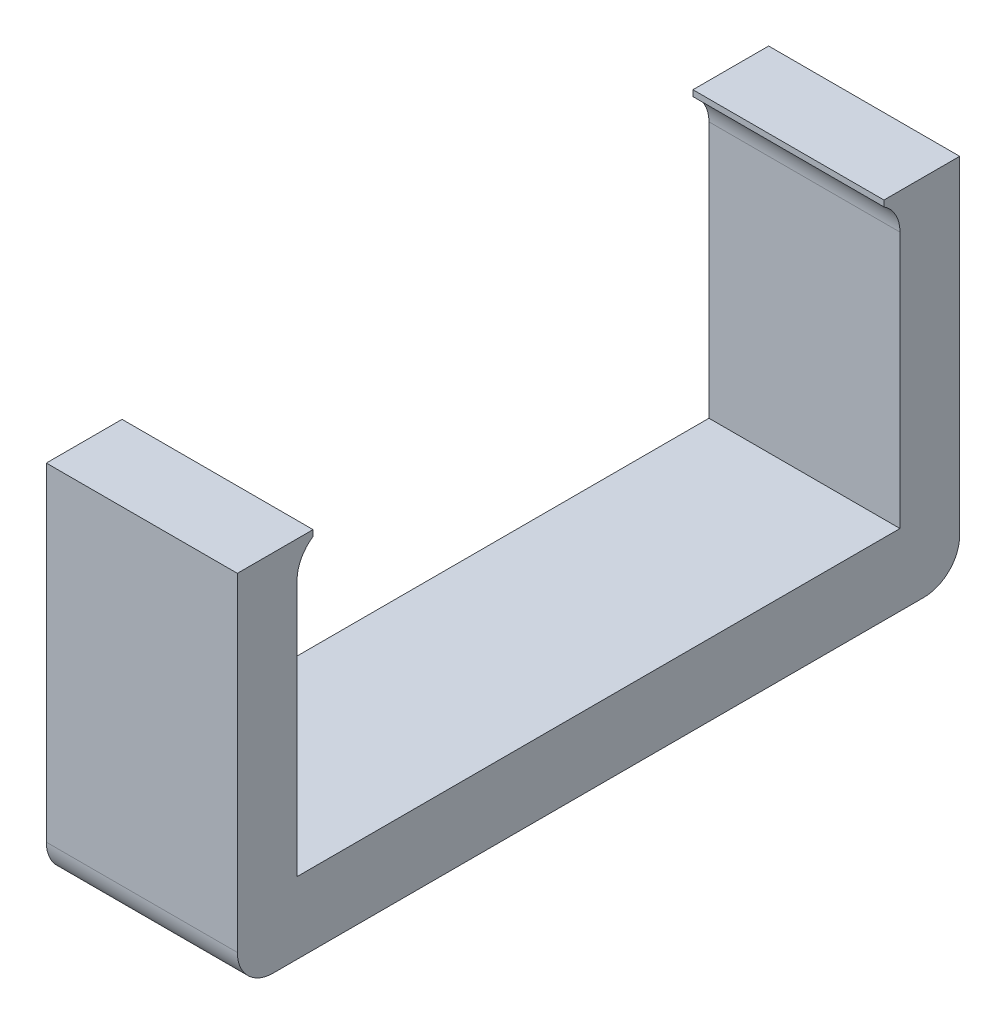
ISO-10303-21;
HEADER;
FILE_DESCRIPTION(('STEP AP214'),'2;1');
FILE_NAME('part.step','',(''),(''),'','','');
FILE_SCHEMA(('AUTOMOTIVE_DESIGN { 1 0 10303 214 1 1 1 1 }'));
ENDSEC;
DATA;
#1=APPLICATION_CONTEXT('core data for automotive mechanical design processes');
#2=APPLICATION_PROTOCOL_DEFINITION('international standard','automotive_design',2000,#1);
#3=PRODUCT_CONTEXT('',#1,'mechanical');
#4=PRODUCT('Part','Part','',(#3));
#5=PRODUCT_RELATED_PRODUCT_CATEGORY('part','',(#4));
#6=PRODUCT_DEFINITION_FORMATION('','',#4);
#7=PRODUCT_DEFINITION_CONTEXT('part definition',#1,'design');
#8=PRODUCT_DEFINITION('design','',#6,#7);
#9=PRODUCT_DEFINITION_SHAPE('','',#8);
#10=(LENGTH_UNIT() NAMED_UNIT(*) SI_UNIT(.MILLI.,.METRE.));
#11=(NAMED_UNIT(*) PLANE_ANGLE_UNIT() SI_UNIT($,.RADIAN.));
#12=(NAMED_UNIT(*) SI_UNIT($,.STERADIAN.) SOLID_ANGLE_UNIT());
#13=UNCERTAINTY_MEASURE_WITH_UNIT(LENGTH_MEASURE(1.E-05),#10,'distance_accuracy_value','');
#14=(GEOMETRIC_REPRESENTATION_CONTEXT(3) GLOBAL_UNCERTAINTY_ASSIGNED_CONTEXT((#13)) GLOBAL_UNIT_ASSIGNED_CONTEXT((#10,
#11,#12)) REPRESENTATION_CONTEXT('',''));
#15=CARTESIAN_POINT('',(0.,0.,0.));
#16=DIRECTION('',(0.,0.,1.));
#17=DIRECTION('',(1.,0.,0.));
#18=AXIS2_PLACEMENT_3D('',#15,#16,#17);
#19=CARTESIAN_POINT('',(8.,3.,-27.75));
#20=DIRECTION('',(0.,0.,-1.));
#21=DIRECTION('',(-1.,0.,0.));
#22=AXIS2_PLACEMENT_3D('',#19,#20,#21);
#23=PLANE('',#22);
#24=DIRECTION('',(0.,-1.,0.));
#25=VECTOR('',#24,1.);
#26=CARTESIAN_POINT('',(0.,3.,-27.75));
#27=LINE('',#26,#25);
#28=CARTESIAN_POINT('',(0.,13.75,-27.75));
#29=VERTEX_POINT('',#28);
#30=CARTESIAN_POINT('',(0.,3.,-27.75));
#31=VERTEX_POINT('',#30);
#32=EDGE_CURVE('E171',#29,#31,#27,.T.);
#33=ORIENTED_EDGE('',*,*,#32,.T.);
#34=DIRECTION('',(-1.,0.,0.));
#35=VECTOR('',#34,1.);
#36=CARTESIAN_POINT('',(8.,3.,-27.75));
#37=LINE('',#36,#35);
#38=CARTESIAN_POINT('',(8.,3.,-27.75));
#39=VERTEX_POINT('',#38);
#40=EDGE_CURVE('E11',#39,#31,#37,.T.);
#41=ORIENTED_EDGE('',*,*,#40,.F.);
#42=DIRECTION('',(0.,-1.,0.));
#43=VECTOR('',#42,1.);
#44=CARTESIAN_POINT('',(8.,3.,-27.75));
#45=LINE('',#44,#43);
#46=CARTESIAN_POINT('',(8.,13.75,-27.75));
#47=VERTEX_POINT('',#46);
#48=EDGE_CURVE('E197',#47,#39,#45,.T.);
#49=ORIENTED_EDGE('',*,*,#48,.F.);
#50=DIRECTION('',(-1.,0.,0.));
#51=VECTOR('',#50,1.);
#52=CARTESIAN_POINT('',(8.,13.75,-27.75));
#53=LINE('',#52,#51);
#54=EDGE_CURVE('E167',#47,#29,#53,.T.);
#55=ORIENTED_EDGE('',*,*,#54,.T.);
#56=EDGE_LOOP('',(#33,#41,#49,#55));
#57=FACE_BOUND('',#56,.T.);
#58=ADVANCED_FACE('F39',(#57),#23,.F.);
#59=CARTESIAN_POINT('',(8.,3.,-27.75));
#60=DIRECTION('',(0.,-1.,0.));
#61=DIRECTION('',(0.,0.,-1.));
#62=AXIS2_PLACEMENT_3D('',#59,#60,#61);
#63=PLANE('',#62);
#64=DIRECTION('',(0.,0.,1.));
#65=VECTOR('',#64,1.);
#66=CARTESIAN_POINT('',(0.,3.,-27.75));
#67=LINE('',#66,#65);
#68=CARTESIAN_POINT('',(0.,3.,-2.5));
#69=VERTEX_POINT('',#68);
#70=EDGE_CURVE('E174',#31,#69,#67,.T.);
#71=ORIENTED_EDGE('',*,*,#70,.T.);
#72=DIRECTION('',(-1.,0.,0.));
#73=VECTOR('',#72,1.);
#74=CARTESIAN_POINT('',(8.,3.,-2.5));
#75=LINE('',#74,#73);
#76=CARTESIAN_POINT('',(8.,3.,-2.5));
#77=VERTEX_POINT('',#76);
#78=EDGE_CURVE('E47',#77,#69,#75,.T.);
#79=ORIENTED_EDGE('',*,*,#78,.F.);
#80=DIRECTION('',(0.,0.,1.));
#81=VECTOR('',#80,1.);
#82=CARTESIAN_POINT('',(8.,3.,-27.75));
#83=LINE('',#82,#81);
#84=EDGE_CURVE('E116',#39,#77,#83,.T.);
#85=ORIENTED_EDGE('',*,*,#84,.F.);
#86=ORIENTED_EDGE('',*,*,#40,.T.);
#87=EDGE_LOOP('',(#71,#79,#85,#86));
#88=FACE_BOUND('',#87,.T.);
#89=ADVANCED_FACE('F285',(#88),#63,.F.);
#90=CARTESIAN_POINT('',(8.,3.,-2.5));
#91=DIRECTION('',(0.,0.,1.));
#92=DIRECTION('',(0.,-1.,0.));
#93=AXIS2_PLACEMENT_3D('',#90,#91,#92);
#94=PLANE('',#93);
#95=DIRECTION('',(0.,1.,0.));
#96=VECTOR('',#95,1.);
#97=CARTESIAN_POINT('',(0.,3.,-2.5));
#98=LINE('',#97,#96);
#99=CARTESIAN_POINT('',(0.,13.75,-2.5));
#100=VERTEX_POINT('',#99);
#101=EDGE_CURVE('E176',#69,#100,#98,.T.);
#102=ORIENTED_EDGE('',*,*,#101,.T.);
#103=DIRECTION('',(-1.,0.,0.));
#104=VECTOR('',#103,1.);
#105=CARTESIAN_POINT('',(8.,13.75,-2.5));
#106=LINE('',#105,#104);
#107=CARTESIAN_POINT('',(8.,13.75,-2.5));
#108=VERTEX_POINT('',#107);
#109=EDGE_CURVE('E222',#108,#100,#106,.T.);
#110=ORIENTED_EDGE('',*,*,#109,.F.);
#111=DIRECTION('',(0.,1.,0.));
#112=VECTOR('',#111,1.);
#113=CARTESIAN_POINT('',(8.,3.,-2.5));
#114=LINE('',#113,#112);
#115=EDGE_CURVE('E230',#77,#108,#114,.T.);
#116=ORIENTED_EDGE('',*,*,#115,.F.);
#117=ORIENTED_EDGE('',*,*,#78,.T.);
#118=EDGE_LOOP('',(#102,#110,#116,#117));
#119=FACE_BOUND('',#118,.T.);
#120=ADVANCED_FACE('F228',(#119),#94,.F.);
#121=CARTESIAN_POINT('',(8.,13.75,-4.));
#122=DIRECTION('',(-1.,0.,0.));
#123=DIRECTION('',(0.,0.,1.));
#124=AXIS2_PLACEMENT_3D('',#121,#122,#123);
#125=CYLINDRICAL_SURFACE('',#124,1.5);
#126=CARTESIAN_POINT('',(0.,13.75,-4.));
#127=DIRECTION('',(-1.,0.,0.));
#128=DIRECTION('',(0.,0.,1.));
#129=AXIS2_PLACEMENT_3D('',#126,#127,#128);
#130=CIRCLE('',#129,1.5);
#131=CARTESIAN_POINT('',(0.,15.,-3.17084380241115));
#132=VERTEX_POINT('',#131);
#133=EDGE_CURVE('E178',#100,#132,#130,.T.);
#134=ORIENTED_EDGE('',*,*,#133,.T.);
#135=DIRECTION('',(-1.,0.,0.));
#136=VECTOR('',#135,1.);
#137=CARTESIAN_POINT('',(8.,15.,-3.17084380241115));
#138=LINE('',#137,#136);
#139=CARTESIAN_POINT('',(8.,15.,-3.17084380241115));
#140=VERTEX_POINT('',#139);
#141=EDGE_CURVE('E219',#140,#132,#138,.T.);
#142=ORIENTED_EDGE('',*,*,#141,.F.);
#143=CARTESIAN_POINT('',(8.,13.75,-4.));
#144=DIRECTION('',(-1.,0.,0.));
#145=DIRECTION('',(0.,0.,1.));
#146=AXIS2_PLACEMENT_3D('',#143,#144,#145);
#147=CIRCLE('',#146,1.5);
#148=EDGE_CURVE('E248',#108,#140,#147,.T.);
#149=ORIENTED_EDGE('',*,*,#148,.F.);
#150=ORIENTED_EDGE('',*,*,#109,.T.);
#151=EDGE_LOOP('',(#134,#142,#149,#150));
#152=FACE_BOUND('',#151,.T.);
#153=ADVANCED_FACE('F239',(#152),#125,.F.);
#154=CARTESIAN_POINT('',(8.,15.25,-3.17084380241115));
#155=DIRECTION('',(0.,0.,1.));
#156=DIRECTION('',(1.,0.,0.));
#157=AXIS2_PLACEMENT_3D('',#154,#155,#156);
#158=PLANE('',#157);
#159=DIRECTION('',(0.,1.,0.));
#160=VECTOR('',#159,1.);
#161=CARTESIAN_POINT('',(0.,15.25,-3.17084380241115));
#162=LINE('',#161,#160);
#163=CARTESIAN_POINT('',(0.,15.25,-3.17084380241115));
#164=VERTEX_POINT('',#163);
#165=EDGE_CURVE('E180',#132,#164,#162,.T.);
#166=ORIENTED_EDGE('',*,*,#165,.T.);
#167=DIRECTION('',(-1.,0.,0.));
#168=VECTOR('',#167,1.);
#169=CARTESIAN_POINT('',(8.,15.25,-3.17084380241115));
#170=LINE('',#169,#168);
#171=CARTESIAN_POINT('',(8.,15.25,-3.17084380241115));
#172=VERTEX_POINT('',#171);
#173=EDGE_CURVE('E216',#172,#164,#170,.T.);
#174=ORIENTED_EDGE('',*,*,#173,.F.);
#175=DIRECTION('',(0.,1.,0.));
#176=VECTOR('',#175,1.);
#177=CARTESIAN_POINT('',(8.,15.25,-3.17084380241115));
#178=LINE('',#177,#176);
#179=EDGE_CURVE('E245',#140,#172,#178,.T.);
#180=ORIENTED_EDGE('',*,*,#179,.F.);
#181=ORIENTED_EDGE('',*,*,#141,.T.);
#182=EDGE_LOOP('',(#166,#174,#180,#181));
#183=FACE_BOUND('',#182,.T.);
#184=ADVANCED_FACE('F243',(#183),#158,.F.);
#185=CARTESIAN_POINT('',(8.,15.25,-3.17084380241115));
#186=DIRECTION('',(0.,-1.,0.));
#187=DIRECTION('',(0.,0.,-1.));
#188=AXIS2_PLACEMENT_3D('',#185,#186,#187);
#189=PLANE('',#188);
#190=DIRECTION('',(0.,0.,1.));
#191=VECTOR('',#190,1.);
#192=CARTESIAN_POINT('',(0.,15.25,-3.17084380241115));
#193=LINE('',#192,#191);
#194=CARTESIAN_POINT('',(0.,15.25,0.));
#195=VERTEX_POINT('',#194);
#196=EDGE_CURVE('E182',#164,#195,#193,.T.);
#197=ORIENTED_EDGE('',*,*,#196,.T.);
#198=DIRECTION('',(-1.,0.,0.));
#199=VECTOR('',#198,1.);
#200=CARTESIAN_POINT('',(8.,15.25,0.));
#201=LINE('',#200,#199);
#202=CARTESIAN_POINT('',(8.,15.25,0.));
#203=VERTEX_POINT('',#202);
#204=EDGE_CURVE('E213',#203,#195,#201,.T.);
#205=ORIENTED_EDGE('',*,*,#204,.F.);
#206=DIRECTION('',(0.,0.,1.));
#207=VECTOR('',#206,1.);
#208=CARTESIAN_POINT('',(8.,15.25,-3.17084380241115));
#209=LINE('',#208,#207);
#210=EDGE_CURVE('E247',#172,#203,#209,.T.);
#211=ORIENTED_EDGE('',*,*,#210,.F.);
#212=ORIENTED_EDGE('',*,*,#173,.T.);
#213=EDGE_LOOP('',(#197,#205,#211,#212));
#214=FACE_BOUND('',#213,.T.);
#215=ADVANCED_FACE('F298',(#214),#189,.F.);
#216=CARTESIAN_POINT('',(8.,15.25,0.));
#217=DIRECTION('',(0.,0.,-1.));
#218=DIRECTION('',(0.,1.,0.));
#219=AXIS2_PLACEMENT_3D('',#216,#217,#218);
#220=PLANE('',#219);
#221=DIRECTION('',(0.,-1.,0.));
#222=VECTOR('',#221,1.);
#223=CARTESIAN_POINT('',(0.,15.25,0.));
#224=LINE('',#223,#222);
#225=CARTESIAN_POINT('',(0.,1.50000000000001,0.));
#226=VERTEX_POINT('',#225);
#227=EDGE_CURVE('E184',#195,#226,#224,.T.);
#228=ORIENTED_EDGE('',*,*,#227,.T.);
#229=DIRECTION('',(-1.,0.,0.));
#230=VECTOR('',#229,1.);
#231=CARTESIAN_POINT('',(8.,1.50000000000001,0.));
#232=LINE('',#231,#230);
#233=CARTESIAN_POINT('',(8.,1.50000000000001,0.));
#234=VERTEX_POINT('',#233);
#235=EDGE_CURVE('E210',#234,#226,#232,.T.);
#236=ORIENTED_EDGE('',*,*,#235,.F.);
#237=DIRECTION('',(0.,-1.,0.));
#238=VECTOR('',#237,1.);
#239=CARTESIAN_POINT('',(8.,15.25,0.));
#240=LINE('',#239,#238);
#241=EDGE_CURVE('E250',#203,#234,#240,.T.);
#242=ORIENTED_EDGE('',*,*,#241,.F.);
#243=ORIENTED_EDGE('',*,*,#204,.T.);
#244=EDGE_LOOP('',(#228,#236,#242,#243));
#245=FACE_BOUND('',#244,.T.);
#246=ADVANCED_FACE('F301',(#245),#220,.F.);
#247=CARTESIAN_POINT('',(8.,1.5,-1.5));
#248=DIRECTION('',(-1.,0.,0.));
#249=DIRECTION('',(0.,0.,1.));
#250=AXIS2_PLACEMENT_3D('',#247,#248,#249);
#251=CYLINDRICAL_SURFACE('',#250,1.5);
#252=CARTESIAN_POINT('',(0.,1.5,-1.5));
#253=DIRECTION('',(1.,0.,0.));
#254=DIRECTION('',(0.,0.,1.));
#255=AXIS2_PLACEMENT_3D('',#252,#253,#254);
#256=CIRCLE('',#255,1.5);
#257=CARTESIAN_POINT('',(0.,0.,-1.50000000000001));
#258=VERTEX_POINT('',#257);
#259=EDGE_CURVE('E186',#226,#258,#256,.T.);
#260=ORIENTED_EDGE('',*,*,#259,.T.);
#261=DIRECTION('',(-1.,0.,0.));
#262=VECTOR('',#261,1.);
#263=CARTESIAN_POINT('',(8.,0.,-1.50000000000001));
#264=LINE('',#263,#262);
#265=CARTESIAN_POINT('',(8.,0.,-1.50000000000001));
#266=VERTEX_POINT('',#265);
#267=EDGE_CURVE('E207',#266,#258,#264,.T.);
#268=ORIENTED_EDGE('',*,*,#267,.F.);
#269=CARTESIAN_POINT('',(8.,1.5,-1.5));
#270=DIRECTION('',(1.,0.,0.));
#271=DIRECTION('',(0.,0.,1.));
#272=AXIS2_PLACEMENT_3D('',#269,#270,#271);
#273=CIRCLE('',#272,1.5);
#274=EDGE_CURVE('E256',#234,#266,#273,.T.);
#275=ORIENTED_EDGE('',*,*,#274,.F.);
#276=ORIENTED_EDGE('',*,*,#235,.T.);
#277=EDGE_LOOP('',(#260,#268,#275,#276));
#278=FACE_BOUND('',#277,.T.);
#279=ADVANCED_FACE('F305',(#278),#251,.T.);
#280=CARTESIAN_POINT('',(8.,0.,-1.50000000000001));
#281=DIRECTION('',(0.,1.,0.));
#282=DIRECTION('',(0.,0.,1.));
#283=AXIS2_PLACEMENT_3D('',#280,#281,#282);
#284=PLANE('',#283);
#285=DIRECTION('',(0.,0.,-1.));
#286=VECTOR('',#285,1.);
#287=CARTESIAN_POINT('',(0.,0.,-1.50000000000001));
#288=LINE('',#287,#286);
#289=CARTESIAN_POINT('',(0.,0.,-28.75));
#290=VERTEX_POINT('',#289);
#291=EDGE_CURVE('E188',#258,#290,#288,.T.);
#292=ORIENTED_EDGE('',*,*,#291,.T.);
#293=DIRECTION('',(-1.,0.,0.));
#294=VECTOR('',#293,1.);
#295=CARTESIAN_POINT('',(8.,0.,-28.75));
#296=LINE('',#295,#294);
#297=CARTESIAN_POINT('',(8.,0.,-28.75));
#298=VERTEX_POINT('',#297);
#299=EDGE_CURVE('E204',#298,#290,#296,.T.);
#300=ORIENTED_EDGE('',*,*,#299,.F.);
#301=DIRECTION('',(0.,0.,-1.));
#302=VECTOR('',#301,1.);
#303=CARTESIAN_POINT('',(8.,0.,-1.50000000000001));
#304=LINE('',#303,#302);
#305=EDGE_CURVE('E258',#266,#298,#304,.T.);
#306=ORIENTED_EDGE('',*,*,#305,.F.);
#307=ORIENTED_EDGE('',*,*,#267,.T.);
#308=EDGE_LOOP('',(#292,#300,#306,#307));
#309=FACE_BOUND('',#308,.T.);
#310=ADVANCED_FACE('F309',(#309),#284,.F.);
#311=CARTESIAN_POINT('',(8.,1.5,-28.75));
#312=DIRECTION('',(-1.,0.,0.));
#313=DIRECTION('',(0.,0.,1.));
#314=AXIS2_PLACEMENT_3D('',#311,#312,#313);
#315=CYLINDRICAL_SURFACE('',#314,1.5);
#316=CARTESIAN_POINT('',(0.,1.5,-28.75));
#317=DIRECTION('',(1.,0.,0.));
#318=DIRECTION('',(0.,0.,-1.));
#319=AXIS2_PLACEMENT_3D('',#316,#317,#318);
#320=CIRCLE('',#319,1.5);
#321=CARTESIAN_POINT('',(0.,1.5,-30.25));
#322=VERTEX_POINT('',#321);
#323=EDGE_CURVE('E190',#290,#322,#320,.T.);
#324=ORIENTED_EDGE('',*,*,#323,.T.);
#325=DIRECTION('',(-1.,0.,0.));
#326=VECTOR('',#325,1.);
#327=CARTESIAN_POINT('',(8.,1.5,-30.25));
#328=LINE('',#327,#326);
#329=CARTESIAN_POINT('',(8.,1.5,-30.25));
#330=VERTEX_POINT('',#329);
#331=EDGE_CURVE('E201',#330,#322,#328,.T.);
#332=ORIENTED_EDGE('',*,*,#331,.F.);
#333=CARTESIAN_POINT('',(8.,1.5,-28.75));
#334=DIRECTION('',(1.,0.,0.));
#335=DIRECTION('',(0.,0.,-1.));
#336=AXIS2_PLACEMENT_3D('',#333,#334,#335);
#337=CIRCLE('',#336,1.5);
#338=EDGE_CURVE('E260',#298,#330,#337,.T.);
#339=ORIENTED_EDGE('',*,*,#338,.F.);
#340=ORIENTED_EDGE('',*,*,#299,.T.);
#341=EDGE_LOOP('',(#324,#332,#339,#340));
#342=FACE_BOUND('',#341,.T.);
#343=ADVANCED_FACE('F266',(#342),#315,.T.);
#344=CARTESIAN_POINT('',(8.,1.5,-30.25));
#345=DIRECTION('',(0.,0.,1.));
#346=DIRECTION('',(1.,0.,0.));
#347=AXIS2_PLACEMENT_3D('',#344,#345,#346);
#348=PLANE('',#347);
#349=DIRECTION('',(0.,1.,0.));
#350=VECTOR('',#349,1.);
#351=CARTESIAN_POINT('',(0.,1.5,-30.25));
#352=LINE('',#351,#350);
#353=CARTESIAN_POINT('',(0.,15.25,-30.25));
#354=VERTEX_POINT('',#353);
#355=EDGE_CURVE('E192',#322,#354,#352,.T.);
#356=ORIENTED_EDGE('',*,*,#355,.T.);
#357=DIRECTION('',(-1.,0.,0.));
#358=VECTOR('',#357,1.);
#359=CARTESIAN_POINT('',(8.,15.25,-30.25));
#360=LINE('',#359,#358);
#361=CARTESIAN_POINT('',(8.,15.25,-30.25));
#362=VERTEX_POINT('',#361);
#363=EDGE_CURVE('E162',#362,#354,#360,.T.);
#364=ORIENTED_EDGE('',*,*,#363,.F.);
#365=DIRECTION('',(0.,1.,0.));
#366=VECTOR('',#365,1.);
#367=CARTESIAN_POINT('',(8.,1.5,-30.25));
#368=LINE('',#367,#366);
#369=EDGE_CURVE('E153',#330,#362,#368,.T.);
#370=ORIENTED_EDGE('',*,*,#369,.F.);
#371=ORIENTED_EDGE('',*,*,#331,.T.);
#372=EDGE_LOOP('',(#356,#364,#370,#371));
#373=FACE_BOUND('',#372,.T.);
#374=ADVANCED_FACE('F270',(#373),#348,.F.);
#375=CARTESIAN_POINT('',(8.,15.25,-30.25));
#376=DIRECTION('',(0.,-1.,0.));
#377=DIRECTION('',(0.,0.,-1.));
#378=AXIS2_PLACEMENT_3D('',#375,#376,#377);
#379=PLANE('',#378);
#380=DIRECTION('',(0.,0.,1.));
#381=VECTOR('',#380,1.);
#382=CARTESIAN_POINT('',(0.,15.25,-30.25));
#383=LINE('',#382,#381);
#384=CARTESIAN_POINT('',(0.,15.25,-27.0791561975888));
#385=VERTEX_POINT('',#384);
#386=EDGE_CURVE('E161',#354,#385,#383,.T.);
#387=ORIENTED_EDGE('',*,*,#386,.T.);
#388=DIRECTION('',(-1.,0.,0.));
#389=VECTOR('',#388,1.);
#390=CARTESIAN_POINT('',(8.,15.25,-27.0791561975888));
#391=LINE('',#390,#389);
#392=CARTESIAN_POINT('',(8.,15.25,-27.0791561975888));
#393=VERTEX_POINT('',#392);
#394=EDGE_CURVE('E158',#393,#385,#391,.T.);
#395=ORIENTED_EDGE('',*,*,#394,.F.);
#396=DIRECTION('',(0.,0.,1.));
#397=VECTOR('',#396,1.);
#398=CARTESIAN_POINT('',(8.,15.25,-30.25));
#399=LINE('',#398,#397);
#400=EDGE_CURVE('E147',#362,#393,#399,.T.);
#401=ORIENTED_EDGE('',*,*,#400,.F.);
#402=ORIENTED_EDGE('',*,*,#363,.T.);
#403=EDGE_LOOP('',(#387,#395,#401,#402));
#404=FACE_BOUND('',#403,.T.);
#405=ADVANCED_FACE('F159',(#404),#379,.F.);
#406=CARTESIAN_POINT('',(8.,15.25,-27.0791561975888));
#407=DIRECTION('',(0.,0.,-1.));
#408=DIRECTION('',(-1.,0.,0.));
#409=AXIS2_PLACEMENT_3D('',#406,#407,#408);
#410=PLANE('',#409);
#411=DIRECTION('',(0.,-1.,0.));
#412=VECTOR('',#411,1.);
#413=CARTESIAN_POINT('',(0.,15.25,-27.0791561975888));
#414=LINE('',#413,#412);
#415=CARTESIAN_POINT('',(0.,15.,-27.0791561975888));
#416=VERTEX_POINT('',#415);
#417=EDGE_CURVE('E102',#385,#416,#414,.T.);
#418=ORIENTED_EDGE('',*,*,#417,.T.);
#419=DIRECTION('',(-1.,0.,0.));
#420=VECTOR('',#419,1.);
#421=CARTESIAN_POINT('',(8.,15.,-27.0791561975888));
#422=LINE('',#421,#420);
#423=CARTESIAN_POINT('',(8.,15.,-27.0791561975888));
#424=VERTEX_POINT('',#423);
#425=EDGE_CURVE('E163',#424,#416,#422,.T.);
#426=ORIENTED_EDGE('',*,*,#425,.F.);
#427=DIRECTION('',(0.,-1.,0.));
#428=VECTOR('',#427,1.);
#429=CARTESIAN_POINT('',(8.,15.25,-27.0791561975888));
#430=LINE('',#429,#428);
#431=EDGE_CURVE('E151',#393,#424,#430,.T.);
#432=ORIENTED_EDGE('',*,*,#431,.F.);
#433=ORIENTED_EDGE('',*,*,#394,.T.);
#434=EDGE_LOOP('',(#418,#426,#432,#433));
#435=FACE_BOUND('',#434,.T.);
#436=ADVANCED_FACE('F165',(#435),#410,.F.);
#437=CARTESIAN_POINT('',(8.,13.75,-26.25));
#438=DIRECTION('',(-1.,0.,0.));
#439=DIRECTION('',(0.,0.,1.));
#440=AXIS2_PLACEMENT_3D('',#437,#438,#439);
#441=CYLINDRICAL_SURFACE('',#440,1.49999999999998);
#442=CARTESIAN_POINT('',(0.,13.75,-26.25));
#443=DIRECTION('',(-1.,0.,0.));
#444=DIRECTION('',(0.,0.,-1.));
#445=AXIS2_PLACEMENT_3D('',#442,#443,#444);
#446=CIRCLE('',#445,1.49999999999998);
#447=EDGE_CURVE('E108',#416,#29,#446,.T.);
#448=ORIENTED_EDGE('',*,*,#447,.T.);
#449=ORIENTED_EDGE('',*,*,#54,.F.);
#450=CARTESIAN_POINT('',(8.,13.75,-26.25));
#451=DIRECTION('',(-1.,0.,0.));
#452=DIRECTION('',(0.,0.,-1.));
#453=AXIS2_PLACEMENT_3D('',#450,#451,#452);
#454=CIRCLE('',#453,1.49999999999998);
#455=EDGE_CURVE('E55',#424,#47,#454,.T.);
#456=ORIENTED_EDGE('',*,*,#455,.F.);
#457=ORIENTED_EDGE('',*,*,#425,.T.);
#458=EDGE_LOOP('',(#448,#449,#456,#457));
#459=FACE_BOUND('',#458,.T.);
#460=ADVANCED_FACE('F274',(#459),#441,.F.);
#461=CARTESIAN_POINT('',(8.,13.75,-26.25));
#462=DIRECTION('',(1.,0.,0.));
#463=DIRECTION('',(0.,0.,-1.));
#464=AXIS2_PLACEMENT_3D('',#461,#462,#463);
#465=PLANE('',#464);
#466=ORIENTED_EDGE('',*,*,#48,.T.);
#467=ORIENTED_EDGE('',*,*,#84,.T.);
#468=ORIENTED_EDGE('',*,*,#115,.T.);
#469=ORIENTED_EDGE('',*,*,#148,.T.);
#470=ORIENTED_EDGE('',*,*,#179,.T.);
#471=ORIENTED_EDGE('',*,*,#210,.T.);
#472=ORIENTED_EDGE('',*,*,#241,.T.);
#473=ORIENTED_EDGE('',*,*,#274,.T.);
#474=ORIENTED_EDGE('',*,*,#305,.T.);
#475=ORIENTED_EDGE('',*,*,#338,.T.);
#476=ORIENTED_EDGE('',*,*,#369,.T.);
#477=ORIENTED_EDGE('',*,*,#400,.T.);
#478=ORIENTED_EDGE('',*,*,#431,.T.);
#479=ORIENTED_EDGE('',*,*,#455,.T.);
#480=EDGE_LOOP('',(#466,#467,#468,#469,#470,#471,#472,#473,#474,#475,#476,#477,#478,#479));
#481=FACE_BOUND('',#480,.T.);
#482=ADVANCED_FACE('F149',(#481),#465,.T.);
#483=CARTESIAN_POINT('',(0.,13.75,-26.25));
#484=DIRECTION('',(1.,0.,0.));
#485=DIRECTION('',(0.,0.,-1.));
#486=AXIS2_PLACEMENT_3D('',#483,#484,#485);
#487=PLANE('',#486);
#488=ORIENTED_EDGE('',*,*,#32,.F.);
#489=ORIENTED_EDGE('',*,*,#447,.F.);
#490=ORIENTED_EDGE('',*,*,#417,.F.);
#491=ORIENTED_EDGE('',*,*,#386,.F.);
#492=ORIENTED_EDGE('',*,*,#355,.F.);
#493=ORIENTED_EDGE('',*,*,#323,.F.);
#494=ORIENTED_EDGE('',*,*,#291,.F.);
#495=ORIENTED_EDGE('',*,*,#259,.F.);
#496=ORIENTED_EDGE('',*,*,#227,.F.);
#497=ORIENTED_EDGE('',*,*,#196,.F.);
#498=ORIENTED_EDGE('',*,*,#165,.F.);
#499=ORIENTED_EDGE('',*,*,#133,.F.);
#500=ORIENTED_EDGE('',*,*,#101,.F.);
#501=ORIENTED_EDGE('',*,*,#70,.F.);
#502=EDGE_LOOP('',(#488,#489,#490,#491,#492,#493,#494,#495,#496,#497,#498,#499,#500,#501));
#503=FACE_BOUND('',#502,.T.);
#504=ADVANCED_FACE('F234',(#503),#487,.F.);
#505=CLOSED_SHELL('',(#58,#89,#120,#153,#184,#215,#246,#279,#310,#343,#374,#405,#436,#460,#482,#504));
#506=MANIFOLD_SOLID_BREP('B2',#505);
#507=ADVANCED_BREP_SHAPE_REPRESENTATION('',(#18,#506),#14);
#508=SHAPE_DEFINITION_REPRESENTATION(#9,#507);
ENDSEC;
END-ISO-10303-21;
